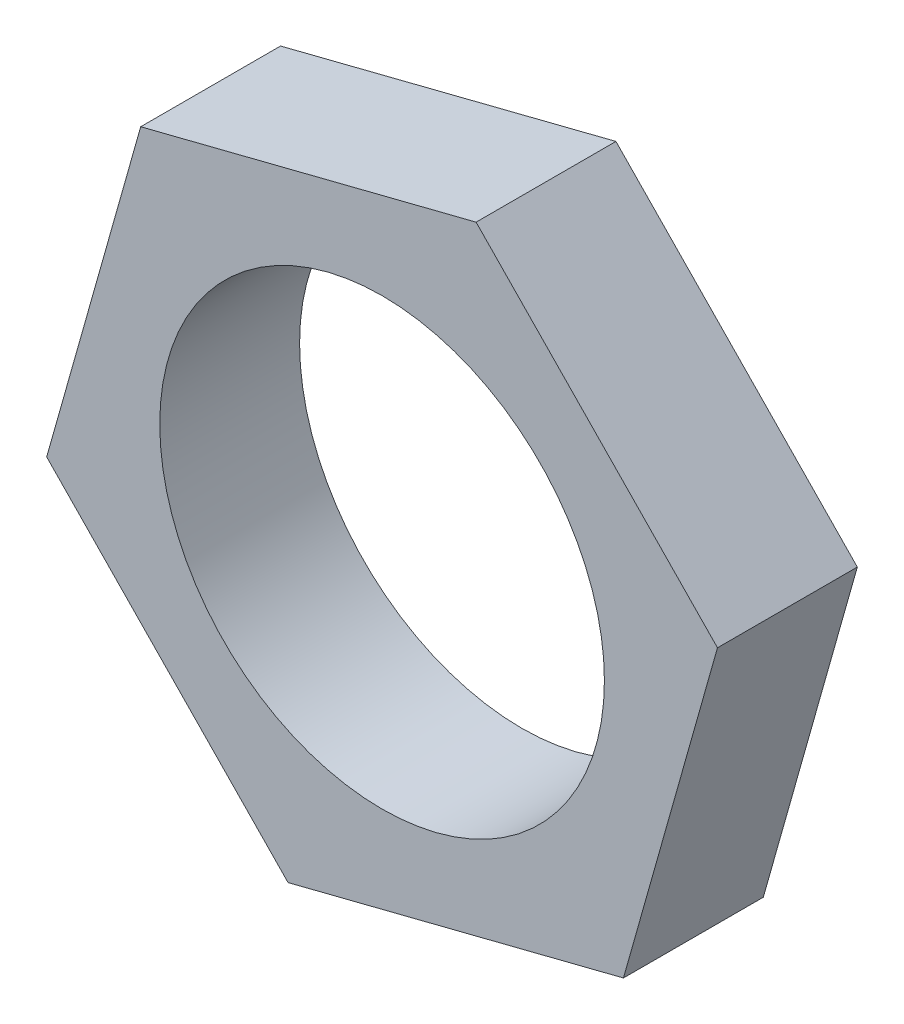
ISO-10303-21;
HEADER;
FILE_DESCRIPTION(('STEP AP214'),'2;1');
FILE_NAME('part.step','',(''),(''),'','','');
FILE_SCHEMA(('AUTOMOTIVE_DESIGN { 1 0 10303 214 1 1 1 1 }'));
ENDSEC;
DATA;
#1=APPLICATION_CONTEXT('core data for automotive mechanical design processes');
#2=APPLICATION_PROTOCOL_DEFINITION('international standard','automotive_design',2000,#1);
#3=PRODUCT_CONTEXT('',#1,'mechanical');
#4=PRODUCT('Part','Part','',(#3));
#5=PRODUCT_RELATED_PRODUCT_CATEGORY('part','',(#4));
#6=PRODUCT_DEFINITION_FORMATION('','',#4);
#7=PRODUCT_DEFINITION_CONTEXT('part definition',#1,'design');
#8=PRODUCT_DEFINITION('design','',#6,#7);
#9=PRODUCT_DEFINITION_SHAPE('','',#8);
#10=(LENGTH_UNIT() NAMED_UNIT(*) SI_UNIT(.MILLI.,.METRE.));
#11=(NAMED_UNIT(*) PLANE_ANGLE_UNIT() SI_UNIT($,.RADIAN.));
#12=(NAMED_UNIT(*) SI_UNIT($,.STERADIAN.) SOLID_ANGLE_UNIT());
#13=UNCERTAINTY_MEASURE_WITH_UNIT(LENGTH_MEASURE(1.E-05),#10,'distance_accuracy_value','');
#14=(GEOMETRIC_REPRESENTATION_CONTEXT(3) GLOBAL_UNCERTAINTY_ASSIGNED_CONTEXT((#13)) GLOBAL_UNIT_ASSIGNED_CONTEXT((#10,
#11,#12)) REPRESENTATION_CONTEXT('',''));
#15=CARTESIAN_POINT('',(0.,0.,0.));
#16=DIRECTION('',(0.,0.,1.));
#17=DIRECTION('',(1.,0.,0.));
#18=AXIS2_PLACEMENT_3D('',#15,#16,#17);
#19=CARTESIAN_POINT('',(0.,0.,2.));
#20=DIRECTION('',(0.,0.,1.));
#21=DIRECTION('',(1.,0.,0.));
#22=AXIS2_PLACEMENT_3D('',#19,#20,#21);
#23=PLANE('',#22);
#24=DIRECTION('',(0.697559990011051,-0.716526384954373,0.));
#25=VECTOR('',#24,1.);
#26=CARTESIAN_POINT('',(-4.79721061221333,-1.21669362488854,2.));
#27=LINE('',#26,#25);
#28=CARTESIAN_POINT('',(-4.79721061221333,-1.21669362488854,2.));
#29=VERTEX_POINT('',#28);
#30=CARTESIAN_POINT('',(-1.34491771833062,-4.76285306992532,2.));
#31=VERTEX_POINT('',#30);
#32=EDGE_CURVE('E150',#29,#31,#27,.T.);
#33=ORIENTED_EDGE('',*,*,#32,.T.);
#34=DIRECTION('',(0.969310046857841,0.245841479536003,0.));
#35=VECTOR('',#34,1.);
#36=CARTESIAN_POINT('',(-1.34491771833062,-4.76285306992532,2.));
#37=LINE('',#36,#35);
#38=CARTESIAN_POINT('',(3.45229289388271,-3.54615944503678,2.));
#39=VERTEX_POINT('',#38);
#40=EDGE_CURVE('E98',#31,#39,#37,.T.);
#41=ORIENTED_EDGE('',*,*,#40,.T.);
#42=DIRECTION('',(0.271750056846789,0.962367864490376,0.));
#43=VECTOR('',#42,1.);
#44=CARTESIAN_POINT('',(3.45229289388271,-3.54615944503678,2.));
#45=LINE('',#44,#43);
#46=CARTESIAN_POINT('',(4.79721061221333,1.21669362488853,2.));
#47=VERTEX_POINT('',#46);
#48=EDGE_CURVE('E111',#39,#47,#45,.T.);
#49=ORIENTED_EDGE('',*,*,#48,.T.);
#50=DIRECTION('',(-0.697559990011051,0.716526384954373,0.));
#51=VECTOR('',#50,1.);
#52=CARTESIAN_POINT('',(4.79721061221333,1.21669362488853,2.));
#53=LINE('',#52,#51);
#54=CARTESIAN_POINT('',(1.34491771833062,4.76285306992531,2.));
#55=VERTEX_POINT('',#54);
#56=EDGE_CURVE('E105',#47,#55,#53,.T.);
#57=ORIENTED_EDGE('',*,*,#56,.T.);
#58=DIRECTION('',(-0.96931004685784,-0.245841479536003,0.));
#59=VECTOR('',#58,1.);
#60=CARTESIAN_POINT('',(1.34491771833062,4.76285306992531,2.));
#61=LINE('',#60,#59);
#62=CARTESIAN_POINT('',(-3.45229289388271,3.54615944503678,2.));
#63=VERTEX_POINT('',#62);
#64=EDGE_CURVE('E109',#55,#63,#61,.T.);
#65=ORIENTED_EDGE('',*,*,#64,.T.);
#66=DIRECTION('',(-0.271750056846789,-0.962367864490376,0.));
#67=VECTOR('',#66,1.);
#68=CARTESIAN_POINT('',(-3.45229289388271,3.54615944503678,2.));
#69=LINE('',#68,#67);
#70=EDGE_CURVE('E61',#63,#29,#69,.T.);
#71=ORIENTED_EDGE('',*,*,#70,.T.);
#72=EDGE_LOOP('',(#33,#41,#49,#57,#65,#71));
#73=FACE_BOUND('',#72,.T.);
#74=CARTESIAN_POINT('',(0.,0.,2.));
#75=DIRECTION('',(0.,0.,1.));
#76=DIRECTION('',(1.,0.,0.));
#77=AXIS2_PLACEMENT_3D('',#74,#75,#76);
#78=CIRCLE('',#77,3.18);
#79=CARTESIAN_POINT('',(3.18,0.,2.));
#80=VERTEX_POINT('',#79);
#81=EDGE_CURVE('E138',#80,#80,#78,.T.);
#82=ORIENTED_EDGE('',*,*,#81,.F.);
#83=EDGE_LOOP('',(#82));
#84=FACE_BOUND('',#83,.T.);
#85=ADVANCED_FACE('F43',(#73,#84),#23,.T.);
#86=CARTESIAN_POINT('',(0.,0.,0.));
#87=DIRECTION('',(0.,0.,1.));
#88=DIRECTION('',(1.,0.,0.));
#89=AXIS2_PLACEMENT_3D('',#86,#87,#88);
#90=PLANE('',#89);
#91=DIRECTION('',(0.697559990011051,-0.716526384954373,0.));
#92=VECTOR('',#91,1.);
#93=CARTESIAN_POINT('',(-4.79721061221333,-1.21669362488854,0.));
#94=LINE('',#93,#92);
#95=CARTESIAN_POINT('',(-4.79721061221333,-1.21669362488854,0.));
#96=VERTEX_POINT('',#95);
#97=CARTESIAN_POINT('',(-1.34491771833062,-4.76285306992532,0.));
#98=VERTEX_POINT('',#97);
#99=EDGE_CURVE('E133',#96,#98,#94,.T.);
#100=ORIENTED_EDGE('',*,*,#99,.F.);
#101=DIRECTION('',(-0.271750056846789,-0.962367864490376,0.));
#102=VECTOR('',#101,1.);
#103=CARTESIAN_POINT('',(-3.45229289388271,3.54615944503678,0.));
#104=LINE('',#103,#102);
#105=CARTESIAN_POINT('',(-3.45229289388271,3.54615944503678,0.));
#106=VERTEX_POINT('',#105);
#107=EDGE_CURVE('E90',#106,#96,#104,.T.);
#108=ORIENTED_EDGE('',*,*,#107,.F.);
#109=DIRECTION('',(-0.96931004685784,-0.245841479536003,0.));
#110=VECTOR('',#109,1.);
#111=CARTESIAN_POINT('',(1.34491771833062,4.76285306992531,0.));
#112=LINE('',#111,#110);
#113=CARTESIAN_POINT('',(1.34491771833062,4.76285306992531,0.));
#114=VERTEX_POINT('',#113);
#115=EDGE_CURVE('E84',#114,#106,#112,.T.);
#116=ORIENTED_EDGE('',*,*,#115,.F.);
#117=DIRECTION('',(-0.697559990011051,0.716526384954373,0.));
#118=VECTOR('',#117,1.);
#119=CARTESIAN_POINT('',(4.79721061221333,1.21669362488853,0.));
#120=LINE('',#119,#118);
#121=CARTESIAN_POINT('',(4.79721061221333,1.21669362488853,0.));
#122=VERTEX_POINT('',#121);
#123=EDGE_CURVE('E120',#122,#114,#120,.T.);
#124=ORIENTED_EDGE('',*,*,#123,.F.);
#125=DIRECTION('',(0.271750056846789,0.962367864490376,0.));
#126=VECTOR('',#125,1.);
#127=CARTESIAN_POINT('',(3.45229289388271,-3.54615944503678,0.));
#128=LINE('',#127,#126);
#129=CARTESIAN_POINT('',(3.45229289388271,-3.54615944503678,0.));
#130=VERTEX_POINT('',#129);
#131=EDGE_CURVE('E141',#130,#122,#128,.T.);
#132=ORIENTED_EDGE('',*,*,#131,.F.);
#133=DIRECTION('',(0.969310046857841,0.245841479536003,0.));
#134=VECTOR('',#133,1.);
#135=CARTESIAN_POINT('',(-1.34491771833062,-4.76285306992532,0.));
#136=LINE('',#135,#134);
#137=EDGE_CURVE('E137',#98,#130,#136,.T.);
#138=ORIENTED_EDGE('',*,*,#137,.F.);
#139=EDGE_LOOP('',(#100,#108,#116,#124,#132,#138));
#140=FACE_BOUND('',#139,.T.);
#141=CARTESIAN_POINT('',(0.,0.,0.));
#142=DIRECTION('',(0.,0.,1.));
#143=DIRECTION('',(1.,0.,0.));
#144=AXIS2_PLACEMENT_3D('',#141,#142,#143);
#145=CIRCLE('',#144,3.18);
#146=CARTESIAN_POINT('',(3.18,0.,0.));
#147=VERTEX_POINT('',#146);
#148=EDGE_CURVE('E253',#147,#147,#145,.T.);
#149=ORIENTED_EDGE('',*,*,#148,.T.);
#150=EDGE_LOOP('',(#149));
#151=FACE_BOUND('',#150,.T.);
#152=ADVANCED_FACE('F163',(#140,#151),#90,.F.);
#153=CARTESIAN_POINT('',(-4.79721061221333,-1.21669362488854,2.));
#154=DIRECTION('',(0.716526384954373,0.697559990011052,0.));
#155=DIRECTION('',(-0.697559990011051,0.716526384954373,0.));
#156=AXIS2_PLACEMENT_3D('',#153,#154,#155);
#157=PLANE('',#156);
#158=ORIENTED_EDGE('',*,*,#99,.T.);
#159=DIRECTION('',(0.,0.,-1.));
#160=VECTOR('',#159,1.);
#161=CARTESIAN_POINT('',(-1.34491771833062,-4.76285306992532,2.));
#162=LINE('',#161,#160);
#163=EDGE_CURVE('E11',#31,#98,#162,.T.);
#164=ORIENTED_EDGE('',*,*,#163,.F.);
#165=ORIENTED_EDGE('',*,*,#32,.F.);
#166=DIRECTION('',(0.,0.,-1.));
#167=VECTOR('',#166,1.);
#168=CARTESIAN_POINT('',(-4.79721061221333,-1.21669362488854,2.));
#169=LINE('',#168,#167);
#170=EDGE_CURVE('E129',#29,#96,#169,.T.);
#171=ORIENTED_EDGE('',*,*,#170,.T.);
#172=EDGE_LOOP('',(#158,#164,#165,#171));
#173=FACE_BOUND('',#172,.T.);
#174=ADVANCED_FACE('F45',(#173),#157,.F.);
#175=CARTESIAN_POINT('',(-1.34491771833062,-4.76285306992532,2.));
#176=DIRECTION('',(-0.245841479536003,0.969310046857841,0.));
#177=DIRECTION('',(-0.969310046857841,-0.245841479536003,0.));
#178=AXIS2_PLACEMENT_3D('',#175,#176,#177);
#179=PLANE('',#178);
#180=ORIENTED_EDGE('',*,*,#137,.T.);
#181=DIRECTION('',(0.,0.,-1.));
#182=VECTOR('',#181,1.);
#183=CARTESIAN_POINT('',(3.45229289388271,-3.54615944503678,2.));
#184=LINE('',#183,#182);
#185=EDGE_CURVE('E53',#39,#130,#184,.T.);
#186=ORIENTED_EDGE('',*,*,#185,.F.);
#187=ORIENTED_EDGE('',*,*,#40,.F.);
#188=ORIENTED_EDGE('',*,*,#163,.T.);
#189=EDGE_LOOP('',(#180,#186,#187,#188));
#190=FACE_BOUND('',#189,.T.);
#191=ADVANCED_FACE('F188',(#190),#179,.F.);
#192=CARTESIAN_POINT('',(3.45229289388271,-3.54615944503678,2.));
#193=DIRECTION('',(-0.962367864490376,0.271750056846789,0.));
#194=DIRECTION('',(-0.271750056846789,-0.962367864490376,0.));
#195=AXIS2_PLACEMENT_3D('',#192,#193,#194);
#196=PLANE('',#195);
#197=ORIENTED_EDGE('',*,*,#131,.T.);
#198=DIRECTION('',(0.,0.,-1.));
#199=VECTOR('',#198,1.);
#200=CARTESIAN_POINT('',(4.79721061221333,1.21669362488853,2.));
#201=LINE('',#200,#199);
#202=EDGE_CURVE('E122',#47,#122,#201,.T.);
#203=ORIENTED_EDGE('',*,*,#202,.F.);
#204=ORIENTED_EDGE('',*,*,#48,.F.);
#205=ORIENTED_EDGE('',*,*,#185,.T.);
#206=EDGE_LOOP('',(#197,#203,#204,#205));
#207=FACE_BOUND('',#206,.T.);
#208=ADVANCED_FACE('F160',(#207),#196,.F.);
#209=CARTESIAN_POINT('',(4.79721061221333,1.21669362488853,2.));
#210=DIRECTION('',(-0.716526384954373,-0.697559990011051,0.));
#211=DIRECTION('',(0.697559990011051,-0.716526384954373,0.));
#212=AXIS2_PLACEMENT_3D('',#209,#210,#211);
#213=PLANE('',#212);
#214=ORIENTED_EDGE('',*,*,#123,.T.);
#215=DIRECTION('',(0.,0.,-1.));
#216=VECTOR('',#215,1.);
#217=CARTESIAN_POINT('',(1.34491771833062,4.76285306992531,2.));
#218=LINE('',#217,#216);
#219=EDGE_CURVE('E117',#55,#114,#218,.T.);
#220=ORIENTED_EDGE('',*,*,#219,.F.);
#221=ORIENTED_EDGE('',*,*,#56,.F.);
#222=ORIENTED_EDGE('',*,*,#202,.T.);
#223=EDGE_LOOP('',(#214,#220,#221,#222));
#224=FACE_BOUND('',#223,.T.);
#225=ADVANCED_FACE('F118',(#224),#213,.F.);
#226=CARTESIAN_POINT('',(1.34491771833062,4.76285306992531,2.));
#227=DIRECTION('',(0.245841479536003,-0.96931004685784,0.));
#228=DIRECTION('',(0.969310046857841,0.245841479536003,0.));
#229=AXIS2_PLACEMENT_3D('',#226,#227,#228);
#230=PLANE('',#229);
#231=ORIENTED_EDGE('',*,*,#115,.T.);
#232=DIRECTION('',(0.,0.,-1.));
#233=VECTOR('',#232,1.);
#234=CARTESIAN_POINT('',(-3.45229289388271,3.54615944503678,2.));
#235=LINE('',#234,#233);
#236=EDGE_CURVE('E123',#63,#106,#235,.T.);
#237=ORIENTED_EDGE('',*,*,#236,.F.);
#238=ORIENTED_EDGE('',*,*,#64,.F.);
#239=ORIENTED_EDGE('',*,*,#219,.T.);
#240=EDGE_LOOP('',(#231,#237,#238,#239));
#241=FACE_BOUND('',#240,.T.);
#242=ADVANCED_FACE('F125',(#241),#230,.F.);
#243=CARTESIAN_POINT('',(-3.45229289388271,3.54615944503678,2.));
#244=DIRECTION('',(0.962367864490376,-0.271750056846789,0.));
#245=DIRECTION('',(0.271750056846789,0.962367864490376,0.));
#246=AXIS2_PLACEMENT_3D('',#243,#244,#245);
#247=PLANE('',#246);
#248=ORIENTED_EDGE('',*,*,#107,.T.);
#249=ORIENTED_EDGE('',*,*,#170,.F.);
#250=ORIENTED_EDGE('',*,*,#70,.F.);
#251=ORIENTED_EDGE('',*,*,#236,.T.);
#252=EDGE_LOOP('',(#248,#249,#250,#251));
#253=FACE_BOUND('',#252,.T.);
#254=ADVANCED_FACE('F168',(#253),#247,.F.);
#255=CARTESIAN_POINT('',(0.,0.,2.));
#256=DIRECTION('',(0.,0.,-1.));
#257=DIRECTION('',(-1.,0.,0.));
#258=AXIS2_PLACEMENT_3D('',#255,#256,#257);
#259=CYLINDRICAL_SURFACE('',#258,3.18);
#260=ORIENTED_EDGE('',*,*,#81,.T.);
#261=EDGE_LOOP('',(#260));
#262=FACE_BOUND('',#261,.T.);
#263=ORIENTED_EDGE('',*,*,#148,.F.);
#264=EDGE_LOOP('',(#263));
#265=FACE_BOUND('',#264,.T.);
#266=ADVANCED_FACE('F170',(#262,#265),#259,.F.);
#267=CLOSED_SHELL('',(#85,#152,#174,#191,#208,#225,#242,#254,#266));
#268=MANIFOLD_SOLID_BREP('B2',#267);
#269=ADVANCED_BREP_SHAPE_REPRESENTATION('',(#18,#268),#14);
#270=SHAPE_DEFINITION_REPRESENTATION(#9,#269);
ENDSEC;
END-ISO-10303-21;
